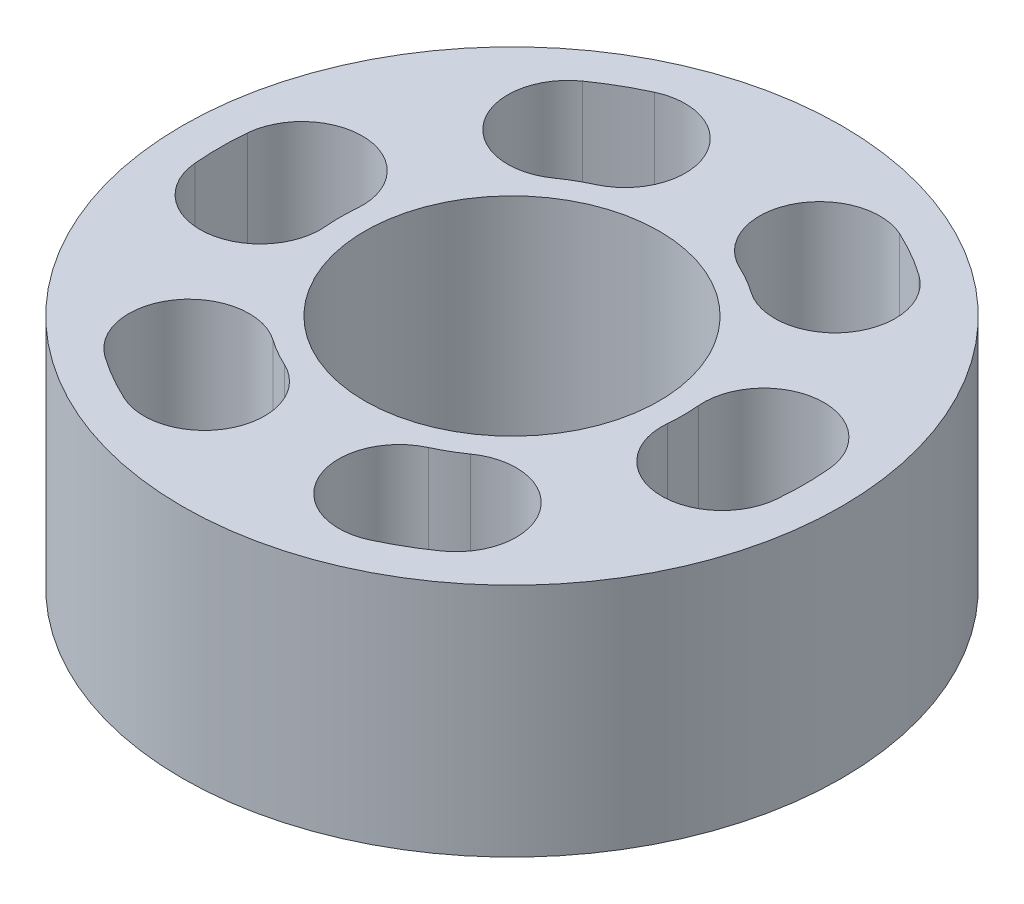
ISO-10303-21;
HEADER;
FILE_DESCRIPTION(('STEP AP214'),'2;1');
FILE_NAME('part.step','',(''),(''),'','','');
FILE_SCHEMA(('AUTOMOTIVE_DESIGN { 1 0 10303 214 1 1 1 1 }'));
ENDSEC;
DATA;
#1=APPLICATION_CONTEXT('core data for automotive mechanical design processes');
#2=APPLICATION_PROTOCOL_DEFINITION('international standard','automotive_design',2000,#1);
#3=PRODUCT_CONTEXT('',#1,'mechanical');
#4=PRODUCT('Part','Part','',(#3));
#5=PRODUCT_RELATED_PRODUCT_CATEGORY('part','',(#4));
#6=PRODUCT_DEFINITION_FORMATION('','',#4);
#7=PRODUCT_DEFINITION_CONTEXT('part definition',#1,'design');
#8=PRODUCT_DEFINITION('design','',#6,#7);
#9=PRODUCT_DEFINITION_SHAPE('','',#8);
#10=(LENGTH_UNIT() NAMED_UNIT(*) SI_UNIT(.MILLI.,.METRE.));
#11=(NAMED_UNIT(*) PLANE_ANGLE_UNIT() SI_UNIT($,.RADIAN.));
#12=(NAMED_UNIT(*) SI_UNIT($,.STERADIAN.) SOLID_ANGLE_UNIT());
#13=UNCERTAINTY_MEASURE_WITH_UNIT(LENGTH_MEASURE(1.E-05),#10,'distance_accuracy_value','');
#14=(GEOMETRIC_REPRESENTATION_CONTEXT(3) GLOBAL_UNCERTAINTY_ASSIGNED_CONTEXT((#13)) GLOBAL_UNIT_ASSIGNED_CONTEXT((#10,
#11,#12)) REPRESENTATION_CONTEXT('',''));
#15=CARTESIAN_POINT('',(0.,0.,0.));
#16=DIRECTION('',(0.,0.,1.));
#17=DIRECTION('',(1.,0.,0.));
#18=AXIS2_PLACEMENT_3D('',#15,#16,#17);
#19=CARTESIAN_POINT('',(0.,12.7,0.));
#20=DIRECTION('',(0.,1.,0.));
#21=DIRECTION('',(0.,0.,1.));
#22=AXIS2_PLACEMENT_3D('',#19,#20,#21);
#23=PLANE('',#22);
#24=CARTESIAN_POINT('',(-12.4492366115643,12.7,1.12539228240097));
#25=DIRECTION('',(0.,1.,0.));
#26=DIRECTION('',(0.866025403784436,0.,-0.500000000000004));
#27=AXIS2_PLACEMENT_3D('',#24,#25,#26);
#28=CIRCLE('',#27,3.25);
#29=CARTESIAN_POINT('',(-15.686038130571,12.7,1.41799427582523));
#30=VERTEX_POINT('',#29);
#31=CARTESIAN_POINT('',(-9.21243509255756,12.7,0.832790288976717));
#32=VERTEX_POINT('',#31);
#33=EDGE_CURVE('E63',#30,#32,#28,.T.);
#34=ORIENTED_EDGE('',*,*,#33,.F.);
#35=CARTESIAN_POINT('',(0.,12.7,0.));
#36=DIRECTION('',(0.,1.,0.));
#37=DIRECTION('',(-0.866025403784436,0.,0.500000000000004));
#38=AXIS2_PLACEMENT_3D('',#35,#36,#37);
#39=CIRCLE('',#38,15.75);
#40=CARTESIAN_POINT('',(-15.686038130571,12.7,-1.41799427582511));
#41=VERTEX_POINT('',#40);
#42=EDGE_CURVE('E245',#41,#30,#39,.T.);
#43=ORIENTED_EDGE('',*,*,#42,.F.);
#44=CARTESIAN_POINT('',(-12.4492366115643,12.7,-1.12539228240088));
#45=DIRECTION('',(0.,1.,0.));
#46=DIRECTION('',(-0.866025403784436,0.,0.500000000000004));
#47=AXIS2_PLACEMENT_3D('',#44,#45,#46);
#48=CIRCLE('',#47,3.25);
#49=CARTESIAN_POINT('',(-9.21243509255757,12.7,-0.832790288976654));
#50=VERTEX_POINT('',#49);
#51=EDGE_CURVE('E260',#50,#41,#48,.T.);
#52=ORIENTED_EDGE('',*,*,#51,.F.);
#53=CARTESIAN_POINT('',(0.,12.7,0.));
#54=DIRECTION('',(0.,-1.,0.));
#55=DIRECTION('',(-0.866025403784436,0.,0.500000000000004));
#56=AXIS2_PLACEMENT_3D('',#53,#54,#55);
#57=CIRCLE('',#56,9.25);
#58=EDGE_CURVE('E256',#32,#50,#57,.T.);
#59=ORIENTED_EDGE('',*,*,#58,.F.);
#60=EDGE_LOOP('',(#34,#43,#52,#59));
#61=FACE_BOUND('',#60,.T.);
#62=CARTESIAN_POINT('',(7.19923661156438,12.7,10.2186590221375));
#63=DIRECTION('',(0.,1.,0.));
#64=DIRECTION('',(-0.866025403784443,0.,-0.499999999999992));
#65=AXIS2_PLACEMENT_3D('',#62,#63,#64);
#66=CIRCLE('',#65,3.25);
#67=CARTESIAN_POINT('',(9.07103813057112,12.7,12.8755103678932));
#68=VERTEX_POINT('',#67);
#69=CARTESIAN_POINT('',(5.32743509255764,12.7,7.56180767638171));
#70=VERTEX_POINT('',#69);
#71=EDGE_CURVE('E317',#68,#70,#66,.T.);
#72=ORIENTED_EDGE('',*,*,#71,.F.);
#73=CARTESIAN_POINT('',(0.,12.7,0.));
#74=DIRECTION('',(0.,1.,0.));
#75=DIRECTION('',(0.866025403784443,0.,0.499999999999992));
#76=AXIS2_PLACEMENT_3D('',#73,#74,#75);
#77=CIRCLE('',#76,15.75);
#78=CARTESIAN_POINT('',(6.6150000000001,12.7,14.2935046437184));
#79=VERTEX_POINT('',#78);
#80=EDGE_CURVE('E307',#79,#68,#77,.T.);
#81=ORIENTED_EDGE('',*,*,#80,.F.);
#82=CARTESIAN_POINT('',(5.25000000000008,12.7,11.3440513045384));
#83=DIRECTION('',(0.,1.,0.));
#84=DIRECTION('',(0.866025403784443,0.,0.499999999999992));
#85=AXIS2_PLACEMENT_3D('',#82,#83,#84);
#86=CIRCLE('',#85,3.25);
#87=CARTESIAN_POINT('',(3.88500000000006,12.7,8.39459796535841));
#88=VERTEX_POINT('',#87);
#89=EDGE_CURVE('E323',#88,#79,#86,.T.);
#90=ORIENTED_EDGE('',*,*,#89,.F.);
#91=CARTESIAN_POINT('',(0.,12.7,0.));
#92=DIRECTION('',(0.,-1.,0.));
#93=DIRECTION('',(0.866025403784443,0.,0.499999999999992));
#94=AXIS2_PLACEMENT_3D('',#91,#92,#93);
#95=CIRCLE('',#94,9.25);
#96=EDGE_CURVE('E319',#70,#88,#95,.T.);
#97=ORIENTED_EDGE('',*,*,#96,.F.);
#98=EDGE_LOOP('',(#72,#81,#90,#97));
#99=FACE_BOUND('',#98,.T.);
#100=CARTESIAN_POINT('',(5.25,12.7,-11.3440513045384));
#101=DIRECTION('',(0.,1.,0.));
#102=DIRECTION('',(0.,0.,1.));
#103=AXIS2_PLACEMENT_3D('',#100,#101,#102);
#104=CIRCLE('',#103,3.25);
#105=CARTESIAN_POINT('',(6.615,12.7,-14.2935046437184));
#106=VERTEX_POINT('',#105);
#107=CARTESIAN_POINT('',(3.885,12.7,-8.39459796535844));
#108=VERTEX_POINT('',#107);
#109=EDGE_CURVE('E237',#106,#108,#104,.T.);
#110=ORIENTED_EDGE('',*,*,#109,.F.);
#111=CARTESIAN_POINT('',(0.,12.7,0.));
#112=DIRECTION('',(0.,1.,0.));
#113=DIRECTION('',(0.,0.,-1.));
#114=AXIS2_PLACEMENT_3D('',#111,#112,#113);
#115=CIRCLE('',#114,15.75);
#116=CARTESIAN_POINT('',(9.07103813057102,12.7,-12.8755103678933));
#117=VERTEX_POINT('',#116);
#118=EDGE_CURVE('E370',#117,#106,#115,.T.);
#119=ORIENTED_EDGE('',*,*,#118,.F.);
#120=CARTESIAN_POINT('',(7.19923661156431,12.7,-10.2186590221375));
#121=DIRECTION('',(0.,1.,0.));
#122=DIRECTION('',(0.,0.,-1.));
#123=AXIS2_PLACEMENT_3D('',#120,#121,#122);
#124=CIRCLE('',#123,3.25);
#125=CARTESIAN_POINT('',(5.32743509255759,12.7,-7.56180767638175));
#126=VERTEX_POINT('',#125);
#127=EDGE_CURVE('E384',#126,#117,#124,.T.);
#128=ORIENTED_EDGE('',*,*,#127,.F.);
#129=CARTESIAN_POINT('',(0.,12.7,0.));
#130=DIRECTION('',(0.,-1.,0.));
#131=DIRECTION('',(0.,0.,-1.));
#132=AXIS2_PLACEMENT_3D('',#129,#130,#131);
#133=CIRCLE('',#132,9.25);
#134=EDGE_CURVE('E381',#108,#126,#133,.T.);
#135=ORIENTED_EDGE('',*,*,#134,.F.);
#136=EDGE_LOOP('',(#110,#119,#128,#135));
#137=FACE_BOUND('',#136,.T.);
#138=CARTESIAN_POINT('',(0.,12.7,0.));
#139=DIRECTION('',(0.,1.,0.));
#140=DIRECTION('',(0.,0.,1.));
#141=AXIS2_PLACEMENT_3D('',#138,#139,#140);
#142=CIRCLE('',#141,17.78);
#143=CARTESIAN_POINT('',(0.,12.7,17.78));
#144=VERTEX_POINT('',#143);
#145=EDGE_CURVE('E11',#144,#144,#142,.T.);
#146=ORIENTED_EDGE('',*,*,#145,.T.);
#147=EDGE_LOOP('',(#146));
#148=FACE_BOUND('',#147,.T.);
#149=CARTESIAN_POINT('',(0.,12.7,0.));
#150=DIRECTION('',(0.,1.,0.));
#151=DIRECTION('',(0.,0.,1.));
#152=AXIS2_PLACEMENT_3D('',#149,#150,#151);
#153=CIRCLE('',#152,7.9375);
#154=CARTESIAN_POINT('',(0.,12.7,7.9375));
#155=VERTEX_POINT('',#154);
#156=EDGE_CURVE('E398',#155,#155,#153,.T.);
#157=ORIENTED_EDGE('',*,*,#156,.F.);
#158=EDGE_LOOP('',(#157));
#159=FACE_BOUND('',#158,.T.);
#160=CARTESIAN_POINT('',(12.4492366115643,12.7,-1.12539228240106));
#161=DIRECTION('',(0.,1.,0.));
#162=DIRECTION('',(-0.866025403784433,0.,0.50000000000001));
#163=AXIS2_PLACEMENT_3D('',#160,#161,#162);
#164=CIRCLE('',#163,3.25);
#165=CARTESIAN_POINT('',(15.686038130571,12.7,-1.41799427582533));
#166=VERTEX_POINT('',#165);
#167=CARTESIAN_POINT('',(9.21243509255756,12.7,-0.832790288976782));
#168=VERTEX_POINT('',#167);
#169=EDGE_CURVE('E349',#166,#168,#164,.T.);
#170=ORIENTED_EDGE('',*,*,#169,.F.);
#171=CARTESIAN_POINT('',(0.,12.7,0.));
#172=DIRECTION('',(0.,1.,0.));
#173=DIRECTION('',(0.866025403784433,0.,-0.50000000000001));
#174=AXIS2_PLACEMENT_3D('',#171,#172,#173);
#175=CIRCLE('',#174,15.75);
#176=CARTESIAN_POINT('',(15.686038130571,12.7,1.417994275825));
#177=VERTEX_POINT('',#176);
#178=EDGE_CURVE('E339',#177,#166,#175,.T.);
#179=ORIENTED_EDGE('',*,*,#178,.F.);
#180=CARTESIAN_POINT('',(12.4492366115643,12.7,1.1253922824008));
#181=DIRECTION('',(0.,1.,0.));
#182=DIRECTION('',(0.866025403784433,0.,-0.50000000000001));
#183=AXIS2_PLACEMENT_3D('',#180,#181,#182);
#184=CIRCLE('',#183,3.25);
#185=CARTESIAN_POINT('',(9.21243509255758,12.7,0.832790288976589));
#186=VERTEX_POINT('',#185);
#187=EDGE_CURVE('E354',#186,#177,#184,.T.);
#188=ORIENTED_EDGE('',*,*,#187,.F.);
#189=CARTESIAN_POINT('',(0.,12.7,0.));
#190=DIRECTION('',(0.,-1.,0.));
#191=DIRECTION('',(0.866025403784433,0.,-0.50000000000001));
#192=AXIS2_PLACEMENT_3D('',#189,#190,#191);
#193=CIRCLE('',#192,9.25);
#194=EDGE_CURVE('E351',#168,#186,#193,.T.);
#195=ORIENTED_EDGE('',*,*,#194,.F.);
#196=EDGE_LOOP('',(#170,#179,#188,#195));
#197=FACE_BOUND('',#196,.T.);
#198=CARTESIAN_POINT('',(-5.25,12.7,11.3440513045384));
#199=DIRECTION('',(0.,1.,0.));
#200=DIRECTION('',(0.,0.,-1.));
#201=AXIS2_PLACEMENT_3D('',#198,#199,#200);
#202=CIRCLE('',#201,3.25);
#203=CARTESIAN_POINT('',(-6.615,12.7,14.2935046437184));
#204=VERTEX_POINT('',#203);
#205=CARTESIAN_POINT('',(-3.885,12.7,8.39459796535844));
#206=VERTEX_POINT('',#205);
#207=EDGE_CURVE('E285',#204,#206,#202,.T.);
#208=ORIENTED_EDGE('',*,*,#207,.F.);
#209=CARTESIAN_POINT('',(0.,12.7,0.));
#210=DIRECTION('',(0.,1.,0.));
#211=DIRECTION('',(0.,0.,1.));
#212=AXIS2_PLACEMENT_3D('',#209,#210,#211);
#213=CIRCLE('',#212,15.75);
#214=CARTESIAN_POINT('',(-9.07103813057102,12.7,12.8755103678933));
#215=VERTEX_POINT('',#214);
#216=EDGE_CURVE('E275',#215,#204,#213,.T.);
#217=ORIENTED_EDGE('',*,*,#216,.F.);
#218=CARTESIAN_POINT('',(-7.19923661156431,12.7,10.2186590221375));
#219=DIRECTION('',(0.,1.,0.));
#220=DIRECTION('',(0.,0.,1.));
#221=AXIS2_PLACEMENT_3D('',#218,#219,#220);
#222=CIRCLE('',#221,3.25);
#223=CARTESIAN_POINT('',(-5.32743509255759,12.7,7.56180767638175));
#224=VERTEX_POINT('',#223);
#225=EDGE_CURVE('E291',#224,#215,#222,.T.);
#226=ORIENTED_EDGE('',*,*,#225,.F.);
#227=CARTESIAN_POINT('',(0.,12.7,0.));
#228=DIRECTION('',(0.,-1.,0.));
#229=DIRECTION('',(0.,0.,1.));
#230=AXIS2_PLACEMENT_3D('',#227,#228,#229);
#231=CIRCLE('',#230,9.25);
#232=EDGE_CURVE('E287',#206,#224,#231,.T.);
#233=ORIENTED_EDGE('',*,*,#232,.F.);
#234=EDGE_LOOP('',(#208,#217,#226,#233));
#235=FACE_BOUND('',#234,.T.);
#236=CARTESIAN_POINT('',(-7.19923661156431,12.7,-10.2186590221375));
#237=DIRECTION('',(0.,1.,0.));
#238=DIRECTION('',(0.86602540378444,0.,0.499999999999998));
#239=AXIS2_PLACEMENT_3D('',#236,#237,#238);
#240=CIRCLE('',#239,3.25);
#241=CARTESIAN_POINT('',(-9.07103813057102,12.7,-12.8755103678932));
#242=VERTEX_POINT('',#241);
#243=CARTESIAN_POINT('',(-5.32743509255759,12.7,-7.56180767638175));
#244=VERTEX_POINT('',#243);
#245=EDGE_CURVE('E55',#242,#244,#240,.T.);
#246=ORIENTED_EDGE('',*,*,#245,.F.);
#247=CARTESIAN_POINT('',(0.,12.7,0.));
#248=DIRECTION('',(0.,1.,0.));
#249=DIRECTION('',(-0.86602540378444,0.,-0.499999999999998));
#250=AXIS2_PLACEMENT_3D('',#247,#248,#249);
#251=CIRCLE('',#250,15.75);
#252=CARTESIAN_POINT('',(-6.615,12.7,-14.2935046437184));
#253=VERTEX_POINT('',#252);
#254=EDGE_CURVE('E221',#253,#242,#251,.T.);
#255=ORIENTED_EDGE('',*,*,#254,.F.);
#256=CARTESIAN_POINT('',(-5.25,12.7,-11.3440513045384));
#257=DIRECTION('',(0.,1.,0.));
#258=DIRECTION('',(-0.86602540378444,0.,-0.499999999999998));
#259=AXIS2_PLACEMENT_3D('',#256,#257,#258);
#260=CIRCLE('',#259,3.25);
#261=CARTESIAN_POINT('',(-3.885,12.7,-8.39459796535844));
#262=VERTEX_POINT('',#261);
#263=EDGE_CURVE('E224',#262,#253,#260,.T.);
#264=ORIENTED_EDGE('',*,*,#263,.F.);
#265=CARTESIAN_POINT('',(0.,12.7,0.));
#266=DIRECTION('',(0.,-1.,0.));
#267=DIRECTION('',(-0.86602540378444,0.,-0.499999999999998));
#268=AXIS2_PLACEMENT_3D('',#265,#266,#267);
#269=CIRCLE('',#268,9.25);
#270=EDGE_CURVE('E230',#244,#262,#269,.T.);
#271=ORIENTED_EDGE('',*,*,#270,.F.);
#272=EDGE_LOOP('',(#246,#255,#264,#271));
#273=FACE_BOUND('',#272,.T.);
#274=ADVANCED_FACE('F40',(#61,#99,#137,#148,#159,#197,#235,#273),#23,.T.);
#275=CARTESIAN_POINT('',(0.,0.,0.));
#276=DIRECTION('',(0.,1.,0.));
#277=DIRECTION('',(0.,0.,1.));
#278=AXIS2_PLACEMENT_3D('',#275,#276,#277);
#279=PLANE('',#278);
#280=CARTESIAN_POINT('',(0.,0.,0.));
#281=DIRECTION('',(0.,1.,0.));
#282=DIRECTION('',(0.,0.,1.));
#283=AXIS2_PLACEMENT_3D('',#280,#281,#282);
#284=CIRCLE('',#283,17.78);
#285=CARTESIAN_POINT('',(0.,0.,17.78));
#286=VERTEX_POINT('',#285);
#287=EDGE_CURVE('E44',#286,#286,#284,.T.);
#288=ORIENTED_EDGE('',*,*,#287,.F.);
#289=EDGE_LOOP('',(#288));
#290=FACE_BOUND('',#289,.T.);
#291=CARTESIAN_POINT('',(0.,0.,0.));
#292=DIRECTION('',(0.,1.,0.));
#293=DIRECTION('',(0.,0.,1.));
#294=AXIS2_PLACEMENT_3D('',#291,#292,#293);
#295=CIRCLE('',#294,7.9375);
#296=CARTESIAN_POINT('',(0.,0.,7.9375));
#297=VERTEX_POINT('',#296);
#298=EDGE_CURVE('E391',#297,#297,#295,.T.);
#299=ORIENTED_EDGE('',*,*,#298,.T.);
#300=EDGE_LOOP('',(#299));
#301=FACE_BOUND('',#300,.T.);
#302=CARTESIAN_POINT('',(0.,0.,0.));
#303=DIRECTION('',(0.,1.,0.));
#304=DIRECTION('',(0.,0.,-1.));
#305=AXIS2_PLACEMENT_3D('',#302,#303,#304);
#306=CIRCLE('',#305,15.75);
#307=CARTESIAN_POINT('',(9.07103813057102,0.,-12.8755103678933));
#308=VERTEX_POINT('',#307);
#309=CARTESIAN_POINT('',(6.615,0.,-14.2935046437184));
#310=VERTEX_POINT('',#309);
#311=EDGE_CURVE('E376',#308,#310,#306,.T.);
#312=ORIENTED_EDGE('',*,*,#311,.T.);
#313=CARTESIAN_POINT('',(5.25,0.,-11.3440513045384));
#314=DIRECTION('',(0.,1.,0.));
#315=DIRECTION('',(0.,0.,1.));
#316=AXIS2_PLACEMENT_3D('',#313,#314,#315);
#317=CIRCLE('',#316,3.25);
#318=CARTESIAN_POINT('',(3.885,0.,-8.39459796535844));
#319=VERTEX_POINT('',#318);
#320=EDGE_CURVE('E366',#310,#319,#317,.T.);
#321=ORIENTED_EDGE('',*,*,#320,.T.);
#322=CARTESIAN_POINT('',(0.,0.,0.));
#323=DIRECTION('',(0.,-1.,0.));
#324=DIRECTION('',(0.,0.,-1.));
#325=AXIS2_PLACEMENT_3D('',#322,#323,#324);
#326=CIRCLE('',#325,9.25);
#327=CARTESIAN_POINT('',(5.32743509255759,0.,-7.56180767638175));
#328=VERTEX_POINT('',#327);
#329=EDGE_CURVE('E369',#319,#328,#326,.T.);
#330=ORIENTED_EDGE('',*,*,#329,.T.);
#331=CARTESIAN_POINT('',(7.19923661156431,0.,-10.2186590221375));
#332=DIRECTION('',(0.,1.,0.));
#333=DIRECTION('',(0.,0.,-1.));
#334=AXIS2_PLACEMENT_3D('',#331,#332,#333);
#335=CIRCLE('',#334,3.25);
#336=EDGE_CURVE('E373',#328,#308,#335,.T.);
#337=ORIENTED_EDGE('',*,*,#336,.T.);
#338=EDGE_LOOP('',(#312,#321,#330,#337));
#339=FACE_BOUND('',#338,.T.);
#340=CARTESIAN_POINT('',(0.,0.,0.));
#341=DIRECTION('',(0.,1.,0.));
#342=DIRECTION('',(0.866025403784433,0.,-0.50000000000001));
#343=AXIS2_PLACEMENT_3D('',#340,#341,#342);
#344=CIRCLE('',#343,15.75);
#345=CARTESIAN_POINT('',(15.686038130571,0.,1.417994275825));
#346=VERTEX_POINT('',#345);
#347=CARTESIAN_POINT('',(15.686038130571,0.,-1.41799427582533));
#348=VERTEX_POINT('',#347);
#349=EDGE_CURVE('E345',#346,#348,#344,.T.);
#350=ORIENTED_EDGE('',*,*,#349,.T.);
#351=CARTESIAN_POINT('',(12.4492366115643,0.,-1.12539228240106));
#352=DIRECTION('',(0.,1.,0.));
#353=DIRECTION('',(-0.866025403784433,0.,0.50000000000001));
#354=AXIS2_PLACEMENT_3D('',#351,#352,#353);
#355=CIRCLE('',#354,3.25);
#356=CARTESIAN_POINT('',(9.21243509255756,0.,-0.832790288976782));
#357=VERTEX_POINT('',#356);
#358=EDGE_CURVE('E335',#348,#357,#355,.T.);
#359=ORIENTED_EDGE('',*,*,#358,.T.);
#360=CARTESIAN_POINT('',(0.,0.,0.));
#361=DIRECTION('',(0.,-1.,0.));
#362=DIRECTION('',(0.866025403784433,0.,-0.50000000000001));
#363=AXIS2_PLACEMENT_3D('',#360,#361,#362);
#364=CIRCLE('',#363,9.25);
#365=CARTESIAN_POINT('',(9.21243509255758,0.,0.832790288976588));
#366=VERTEX_POINT('',#365);
#367=EDGE_CURVE('E338',#357,#366,#364,.T.);
#368=ORIENTED_EDGE('',*,*,#367,.T.);
#369=CARTESIAN_POINT('',(12.4492366115643,0.,1.1253922824008));
#370=DIRECTION('',(0.,1.,0.));
#371=DIRECTION('',(0.866025403784433,0.,-0.50000000000001));
#372=AXIS2_PLACEMENT_3D('',#369,#370,#371);
#373=CIRCLE('',#372,3.25);
#374=EDGE_CURVE('E342',#366,#346,#373,.T.);
#375=ORIENTED_EDGE('',*,*,#374,.T.);
#376=EDGE_LOOP('',(#350,#359,#368,#375));
#377=FACE_BOUND('',#376,.T.);
#378=CARTESIAN_POINT('',(0.,0.,0.));
#379=DIRECTION('',(0.,1.,0.));
#380=DIRECTION('',(0.866025403784443,0.,0.499999999999992));
#381=AXIS2_PLACEMENT_3D('',#378,#379,#380);
#382=CIRCLE('',#381,15.75);
#383=CARTESIAN_POINT('',(6.6150000000001,0.,14.2935046437184));
#384=VERTEX_POINT('',#383);
#385=CARTESIAN_POINT('',(9.07103813057112,0.,12.8755103678932));
#386=VERTEX_POINT('',#385);
#387=EDGE_CURVE('E313',#384,#386,#382,.T.);
#388=ORIENTED_EDGE('',*,*,#387,.T.);
#389=CARTESIAN_POINT('',(7.19923661156438,0.,10.2186590221375));
#390=DIRECTION('',(0.,1.,0.));
#391=DIRECTION('',(-0.866025403784443,0.,-0.499999999999992));
#392=AXIS2_PLACEMENT_3D('',#389,#390,#391);
#393=CIRCLE('',#392,3.25);
#394=CARTESIAN_POINT('',(5.32743509255764,0.,7.56180767638171));
#395=VERTEX_POINT('',#394);
#396=EDGE_CURVE('E303',#386,#395,#393,.T.);
#397=ORIENTED_EDGE('',*,*,#396,.T.);
#398=CARTESIAN_POINT('',(0.,0.,0.));
#399=DIRECTION('',(0.,-1.,0.));
#400=DIRECTION('',(0.866025403784443,0.,0.499999999999992));
#401=AXIS2_PLACEMENT_3D('',#398,#399,#400);
#402=CIRCLE('',#401,9.25);
#403=CARTESIAN_POINT('',(3.88500000000006,0.,8.39459796535841));
#404=VERTEX_POINT('',#403);
#405=EDGE_CURVE('E306',#395,#404,#402,.T.);
#406=ORIENTED_EDGE('',*,*,#405,.T.);
#407=CARTESIAN_POINT('',(5.25000000000008,0.,11.3440513045384));
#408=DIRECTION('',(0.,1.,0.));
#409=DIRECTION('',(0.866025403784443,0.,0.499999999999992));
#410=AXIS2_PLACEMENT_3D('',#407,#408,#409);
#411=CIRCLE('',#410,3.25);
#412=EDGE_CURVE('E310',#404,#384,#411,.T.);
#413=ORIENTED_EDGE('',*,*,#412,.T.);
#414=EDGE_LOOP('',(#388,#397,#406,#413));
#415=FACE_BOUND('',#414,.T.);
#416=CARTESIAN_POINT('',(0.,0.,0.));
#417=DIRECTION('',(0.,1.,0.));
#418=DIRECTION('',(0.,0.,1.));
#419=AXIS2_PLACEMENT_3D('',#416,#417,#418);
#420=CIRCLE('',#419,15.75);
#421=CARTESIAN_POINT('',(-9.07103813057102,0.,12.8755103678933));
#422=VERTEX_POINT('',#421);
#423=CARTESIAN_POINT('',(-6.615,0.,14.2935046437184));
#424=VERTEX_POINT('',#423);
#425=EDGE_CURVE('E281',#422,#424,#420,.T.);
#426=ORIENTED_EDGE('',*,*,#425,.T.);
#427=CARTESIAN_POINT('',(-5.25,0.,11.3440513045384));
#428=DIRECTION('',(0.,1.,0.));
#429=DIRECTION('',(0.,0.,-1.));
#430=AXIS2_PLACEMENT_3D('',#427,#428,#429);
#431=CIRCLE('',#430,3.25);
#432=CARTESIAN_POINT('',(-3.885,0.,8.39459796535844));
#433=VERTEX_POINT('',#432);
#434=EDGE_CURVE('E271',#424,#433,#431,.T.);
#435=ORIENTED_EDGE('',*,*,#434,.T.);
#436=CARTESIAN_POINT('',(0.,0.,0.));
#437=DIRECTION('',(0.,-1.,0.));
#438=DIRECTION('',(0.,0.,1.));
#439=AXIS2_PLACEMENT_3D('',#436,#437,#438);
#440=CIRCLE('',#439,9.25);
#441=CARTESIAN_POINT('',(-5.32743509255759,0.,7.56180767638175));
#442=VERTEX_POINT('',#441);
#443=EDGE_CURVE('E274',#433,#442,#440,.T.);
#444=ORIENTED_EDGE('',*,*,#443,.T.);
#445=CARTESIAN_POINT('',(-7.19923661156431,0.,10.2186590221375));
#446=DIRECTION('',(0.,1.,0.));
#447=DIRECTION('',(0.,0.,1.));
#448=AXIS2_PLACEMENT_3D('',#445,#446,#447);
#449=CIRCLE('',#448,3.25);
#450=EDGE_CURVE('E278',#442,#422,#449,.T.);
#451=ORIENTED_EDGE('',*,*,#450,.T.);
#452=EDGE_LOOP('',(#426,#435,#444,#451));
#453=FACE_BOUND('',#452,.T.);
#454=CARTESIAN_POINT('',(0.,0.,0.));
#455=DIRECTION('',(0.,1.,0.));
#456=DIRECTION('',(-0.866025403784436,0.,0.500000000000004));
#457=AXIS2_PLACEMENT_3D('',#454,#455,#456);
#458=CIRCLE('',#457,15.75);
#459=CARTESIAN_POINT('',(-15.686038130571,0.,-1.41799427582511));
#460=VERTEX_POINT('',#459);
#461=CARTESIAN_POINT('',(-15.686038130571,0.,1.41799427582523));
#462=VERTEX_POINT('',#461);
#463=EDGE_CURVE('E251',#460,#462,#458,.T.);
#464=ORIENTED_EDGE('',*,*,#463,.T.);
#465=CARTESIAN_POINT('',(-12.4492366115643,0.,1.12539228240097));
#466=DIRECTION('',(0.,1.,0.));
#467=DIRECTION('',(0.866025403784436,0.,-0.500000000000004));
#468=AXIS2_PLACEMENT_3D('',#465,#466,#467);
#469=CIRCLE('',#468,3.25);
#470=CARTESIAN_POINT('',(-9.21243509255757,0.,0.832790288976717));
#471=VERTEX_POINT('',#470);
#472=EDGE_CURVE('E241',#462,#471,#469,.T.);
#473=ORIENTED_EDGE('',*,*,#472,.T.);
#474=CARTESIAN_POINT('',(0.,0.,0.));
#475=DIRECTION('',(0.,-1.,0.));
#476=DIRECTION('',(-0.866025403784436,0.,0.500000000000004));
#477=AXIS2_PLACEMENT_3D('',#474,#475,#476);
#478=CIRCLE('',#477,9.25);
#479=CARTESIAN_POINT('',(-9.21243509255757,0.,-0.832790288976653));
#480=VERTEX_POINT('',#479);
#481=EDGE_CURVE('E244',#471,#480,#478,.T.);
#482=ORIENTED_EDGE('',*,*,#481,.T.);
#483=CARTESIAN_POINT('',(-12.4492366115643,0.,-1.12539228240088));
#484=DIRECTION('',(0.,1.,0.));
#485=DIRECTION('',(-0.866025403784436,0.,0.500000000000004));
#486=AXIS2_PLACEMENT_3D('',#483,#484,#485);
#487=CIRCLE('',#486,3.25);
#488=EDGE_CURVE('E248',#480,#460,#487,.T.);
#489=ORIENTED_EDGE('',*,*,#488,.T.);
#490=EDGE_LOOP('',(#464,#473,#482,#489));
#491=FACE_BOUND('',#490,.T.);
#492=CARTESIAN_POINT('',(0.,0.,0.));
#493=DIRECTION('',(0.,1.,0.));
#494=DIRECTION('',(-0.86602540378444,0.,-0.499999999999998));
#495=AXIS2_PLACEMENT_3D('',#492,#493,#494);
#496=CIRCLE('',#495,15.75);
#497=CARTESIAN_POINT('',(-6.615,0.,-14.2935046437184));
#498=VERTEX_POINT('',#497);
#499=CARTESIAN_POINT('',(-9.07103813057102,0.,-12.8755103678932));
#500=VERTEX_POINT('',#499);
#501=EDGE_CURVE('E209',#498,#500,#496,.T.);
#502=ORIENTED_EDGE('',*,*,#501,.T.);
#503=CARTESIAN_POINT('',(-7.19923661156431,0.,-10.2186590221375));
#504=DIRECTION('',(0.,1.,0.));
#505=DIRECTION('',(0.86602540378444,0.,0.499999999999998));
#506=AXIS2_PLACEMENT_3D('',#503,#504,#505);
#507=CIRCLE('',#506,3.25);
#508=CARTESIAN_POINT('',(-5.32743509255759,0.,-7.56180767638175));
#509=VERTEX_POINT('',#508);
#510=EDGE_CURVE('E203',#500,#509,#507,.T.);
#511=ORIENTED_EDGE('',*,*,#510,.T.);
#512=CARTESIAN_POINT('',(0.,0.,0.));
#513=DIRECTION('',(0.,-1.,0.));
#514=DIRECTION('',(-0.86602540378444,0.,-0.499999999999998));
#515=AXIS2_PLACEMENT_3D('',#512,#513,#514);
#516=CIRCLE('',#515,9.25);
#517=CARTESIAN_POINT('',(-3.885,0.,-8.39459796535844));
#518=VERTEX_POINT('',#517);
#519=EDGE_CURVE('E213',#509,#518,#516,.T.);
#520=ORIENTED_EDGE('',*,*,#519,.T.);
#521=CARTESIAN_POINT('',(-5.25,0.,-11.3440513045384));
#522=DIRECTION('',(0.,1.,0.));
#523=DIRECTION('',(-0.86602540378444,0.,-0.499999999999998));
#524=AXIS2_PLACEMENT_3D('',#521,#522,#523);
#525=CIRCLE('',#524,3.25);
#526=EDGE_CURVE('E217',#518,#498,#525,.T.);
#527=ORIENTED_EDGE('',*,*,#526,.T.);
#528=EDGE_LOOP('',(#502,#511,#520,#527));
#529=FACE_BOUND('',#528,.T.);
#530=ADVANCED_FACE('F219',(#290,#301,#339,#377,#415,#453,#491,#529),#279,.F.);
#531=CARTESIAN_POINT('',(0.,12.7,0.));
#532=DIRECTION('',(0.,-1.,0.));
#533=DIRECTION('',(0.,0.,-1.));
#534=AXIS2_PLACEMENT_3D('',#531,#532,#533);
#535=CYLINDRICAL_SURFACE('',#534,17.78);
#536=ORIENTED_EDGE('',*,*,#145,.F.);
#537=EDGE_LOOP('',(#536));
#538=FACE_BOUND('',#537,.T.);
#539=ORIENTED_EDGE('',*,*,#287,.T.);
#540=EDGE_LOOP('',(#539));
#541=FACE_BOUND('',#540,.T.);
#542=ADVANCED_FACE('F42',(#538,#541),#535,.T.);
#543=CARTESIAN_POINT('',(0.,12.7,0.));
#544=DIRECTION('',(0.,-1.,0.));
#545=DIRECTION('',(0.,0.,-1.));
#546=AXIS2_PLACEMENT_3D('',#543,#544,#545);
#547=CYLINDRICAL_SURFACE('',#546,7.9375);
#548=ORIENTED_EDGE('',*,*,#156,.T.);
#549=EDGE_LOOP('',(#548));
#550=FACE_BOUND('',#549,.T.);
#551=ORIENTED_EDGE('',*,*,#298,.F.);
#552=EDGE_LOOP('',(#551));
#553=FACE_BOUND('',#552,.T.);
#554=ADVANCED_FACE('F406',(#550,#553),#547,.F.);
#555=CARTESIAN_POINT('',(5.25,0.,-11.3440513045384));
#556=DIRECTION('',(0.,1.,0.));
#557=DIRECTION('',(0.,0.,1.));
#558=AXIS2_PLACEMENT_3D('',#555,#556,#557);
#559=CYLINDRICAL_SURFACE('',#558,3.25);
#560=ORIENTED_EDGE('',*,*,#109,.T.);
#561=DIRECTION('',(0.,1.,0.));
#562=VECTOR('',#561,1.);
#563=CARTESIAN_POINT('',(3.885,0.,-8.39459796535844));
#564=LINE('',#563,#562);
#565=EDGE_CURVE('E379',#319,#108,#564,.T.);
#566=ORIENTED_EDGE('',*,*,#565,.F.);
#567=ORIENTED_EDGE('',*,*,#320,.F.);
#568=DIRECTION('',(0.,1.,0.));
#569=VECTOR('',#568,1.);
#570=CARTESIAN_POINT('',(6.615,0.,-14.2935046437184));
#571=LINE('',#570,#569);
#572=EDGE_CURVE('E389',#310,#106,#571,.T.);
#573=ORIENTED_EDGE('',*,*,#572,.T.);
#574=EDGE_LOOP('',(#560,#566,#567,#573));
#575=FACE_BOUND('',#574,.T.);
#576=ADVANCED_FACE('F408',(#575),#559,.F.);
#577=CARTESIAN_POINT('',(0.,0.,0.));
#578=DIRECTION('',(0.,1.,0.));
#579=DIRECTION('',(0.,0.,1.));
#580=AXIS2_PLACEMENT_3D('',#577,#578,#579);
#581=CYLINDRICAL_SURFACE('',#580,15.75);
#582=ORIENTED_EDGE('',*,*,#118,.T.);
#583=ORIENTED_EDGE('',*,*,#572,.F.);
#584=ORIENTED_EDGE('',*,*,#311,.F.);
#585=DIRECTION('',(0.,1.,0.));
#586=VECTOR('',#585,1.);
#587=CARTESIAN_POINT('',(9.07103813057102,0.,-12.8755103678933));
#588=LINE('',#587,#586);
#589=EDGE_CURVE('E392',#308,#117,#588,.T.);
#590=ORIENTED_EDGE('',*,*,#589,.T.);
#591=EDGE_LOOP('',(#582,#583,#584,#590));
#592=FACE_BOUND('',#591,.T.);
#593=ADVANCED_FACE('F415',(#592),#581,.F.);
#594=CARTESIAN_POINT('',(7.19923661156431,0.,-10.2186590221375));
#595=DIRECTION('',(0.,1.,0.));
#596=DIRECTION('',(0.,0.,1.));
#597=AXIS2_PLACEMENT_3D('',#594,#595,#596);
#598=CYLINDRICAL_SURFACE('',#597,3.25);
#599=ORIENTED_EDGE('',*,*,#127,.T.);
#600=ORIENTED_EDGE('',*,*,#589,.F.);
#601=ORIENTED_EDGE('',*,*,#336,.F.);
#602=DIRECTION('',(0.,1.,0.));
#603=VECTOR('',#602,1.);
#604=CARTESIAN_POINT('',(5.32743509255759,0.,-7.56180767638175));
#605=LINE('',#604,#603);
#606=EDGE_CURVE('E394',#328,#126,#605,.T.);
#607=ORIENTED_EDGE('',*,*,#606,.T.);
#608=EDGE_LOOP('',(#599,#600,#601,#607));
#609=FACE_BOUND('',#608,.T.);
#610=ADVANCED_FACE('F532',(#609),#598,.F.);
#611=CARTESIAN_POINT('',(0.,0.,0.));
#612=DIRECTION('',(0.,1.,0.));
#613=DIRECTION('',(0.,0.,1.));
#614=AXIS2_PLACEMENT_3D('',#611,#612,#613);
#615=CYLINDRICAL_SURFACE('',#614,9.25);
#616=ORIENTED_EDGE('',*,*,#134,.T.);
#617=ORIENTED_EDGE('',*,*,#606,.F.);
#618=ORIENTED_EDGE('',*,*,#329,.F.);
#619=ORIENTED_EDGE('',*,*,#565,.T.);
#620=EDGE_LOOP('',(#616,#617,#618,#619));
#621=FACE_BOUND('',#620,.T.);
#622=ADVANCED_FACE('F528',(#621),#615,.T.);
#623=CARTESIAN_POINT('',(12.4492366115643,0.,-1.12539228240106));
#624=DIRECTION('',(0.,1.,0.));
#625=DIRECTION('',(0.,0.,1.));
#626=AXIS2_PLACEMENT_3D('',#623,#624,#625);
#627=CYLINDRICAL_SURFACE('',#626,3.25);
#628=ORIENTED_EDGE('',*,*,#169,.T.);
#629=DIRECTION('',(0.,1.,0.));
#630=VECTOR('',#629,1.);
#631=CARTESIAN_POINT('',(9.21243509255756,0.,-0.832790288976782));
#632=LINE('',#631,#630);
#633=EDGE_CURVE('E348',#357,#168,#632,.T.);
#634=ORIENTED_EDGE('',*,*,#633,.F.);
#635=ORIENTED_EDGE('',*,*,#358,.F.);
#636=DIRECTION('',(0.,1.,0.));
#637=VECTOR('',#636,1.);
#638=CARTESIAN_POINT('',(15.686038130571,0.,-1.41799427582533));
#639=LINE('',#638,#637);
#640=EDGE_CURVE('E320',#348,#166,#639,.T.);
#641=ORIENTED_EDGE('',*,*,#640,.T.);
#642=EDGE_LOOP('',(#628,#634,#635,#641));
#643=FACE_BOUND('',#642,.T.);
#644=ADVANCED_FACE('F518',(#643),#627,.F.);
#645=CARTESIAN_POINT('',(0.,0.,0.));
#646=DIRECTION('',(0.,1.,0.));
#647=DIRECTION('',(0.,0.,1.));
#648=AXIS2_PLACEMENT_3D('',#645,#646,#647);
#649=CYLINDRICAL_SURFACE('',#648,15.75);
#650=ORIENTED_EDGE('',*,*,#178,.T.);
#651=ORIENTED_EDGE('',*,*,#640,.F.);
#652=ORIENTED_EDGE('',*,*,#349,.F.);
#653=DIRECTION('',(0.,1.,0.));
#654=VECTOR('',#653,1.);
#655=CARTESIAN_POINT('',(15.686038130571,0.,1.417994275825));
#656=LINE('',#655,#654);
#657=EDGE_CURVE('E360',#346,#177,#656,.T.);
#658=ORIENTED_EDGE('',*,*,#657,.T.);
#659=EDGE_LOOP('',(#650,#651,#652,#658));
#660=FACE_BOUND('',#659,.T.);
#661=ADVANCED_FACE('F514',(#660),#649,.F.);
#662=CARTESIAN_POINT('',(12.4492366115643,0.,1.1253922824008));
#663=DIRECTION('',(0.,1.,0.));
#664=DIRECTION('',(0.,0.,1.));
#665=AXIS2_PLACEMENT_3D('',#662,#663,#664);
#666=CYLINDRICAL_SURFACE('',#665,3.25);
#667=ORIENTED_EDGE('',*,*,#187,.T.);
#668=ORIENTED_EDGE('',*,*,#657,.F.);
#669=ORIENTED_EDGE('',*,*,#374,.F.);
#670=DIRECTION('',(0.,1.,0.));
#671=VECTOR('',#670,1.);
#672=CARTESIAN_POINT('',(9.21243509255758,0.,0.832790288976589));
#673=LINE('',#672,#671);
#674=EDGE_CURVE('E362',#366,#186,#673,.T.);
#675=ORIENTED_EDGE('',*,*,#674,.T.);
#676=EDGE_LOOP('',(#667,#668,#669,#675));
#677=FACE_BOUND('',#676,.T.);
#678=ADVANCED_FACE('F517',(#677),#666,.F.);
#679=CARTESIAN_POINT('',(0.,0.,0.));
#680=DIRECTION('',(0.,1.,0.));
#681=DIRECTION('',(0.,0.,1.));
#682=AXIS2_PLACEMENT_3D('',#679,#680,#681);
#683=CYLINDRICAL_SURFACE('',#682,9.25);
#684=ORIENTED_EDGE('',*,*,#194,.T.);
#685=ORIENTED_EDGE('',*,*,#674,.F.);
#686=ORIENTED_EDGE('',*,*,#367,.F.);
#687=ORIENTED_EDGE('',*,*,#633,.T.);
#688=EDGE_LOOP('',(#684,#685,#686,#687));
#689=FACE_BOUND('',#688,.T.);
#690=ADVANCED_FACE('F512',(#689),#683,.T.);
#691=CARTESIAN_POINT('',(7.19923661156438,0.,10.2186590221375));
#692=DIRECTION('',(0.,1.,0.));
#693=DIRECTION('',(0.,0.,1.));
#694=AXIS2_PLACEMENT_3D('',#691,#692,#693);
#695=CYLINDRICAL_SURFACE('',#694,3.25);
#696=ORIENTED_EDGE('',*,*,#71,.T.);
#697=DIRECTION('',(0.,1.,0.));
#698=VECTOR('',#697,1.);
#699=CARTESIAN_POINT('',(5.32743509255764,0.,7.56180767638171));
#700=LINE('',#699,#698);
#701=EDGE_CURVE('E316',#395,#70,#700,.T.);
#702=ORIENTED_EDGE('',*,*,#701,.F.);
#703=ORIENTED_EDGE('',*,*,#396,.F.);
#704=DIRECTION('',(0.,1.,0.));
#705=VECTOR('',#704,1.);
#706=CARTESIAN_POINT('',(9.07103813057112,0.,12.8755103678932));
#707=LINE('',#706,#705);
#708=EDGE_CURVE('E288',#386,#68,#707,.T.);
#709=ORIENTED_EDGE('',*,*,#708,.T.);
#710=EDGE_LOOP('',(#696,#702,#703,#709));
#711=FACE_BOUND('',#710,.T.);
#712=ADVANCED_FACE('F502',(#711),#695,.F.);
#713=CARTESIAN_POINT('',(0.,0.,0.));
#714=DIRECTION('',(0.,1.,0.));
#715=DIRECTION('',(0.,0.,1.));
#716=AXIS2_PLACEMENT_3D('',#713,#714,#715);
#717=CYLINDRICAL_SURFACE('',#716,15.75);
#718=ORIENTED_EDGE('',*,*,#80,.T.);
#719=ORIENTED_EDGE('',*,*,#708,.F.);
#720=ORIENTED_EDGE('',*,*,#387,.F.);
#721=DIRECTION('',(0.,1.,0.));
#722=VECTOR('',#721,1.);
#723=CARTESIAN_POINT('',(6.6150000000001,0.,14.2935046437184));
#724=LINE('',#723,#722);
#725=EDGE_CURVE('E329',#384,#79,#724,.T.);
#726=ORIENTED_EDGE('',*,*,#725,.T.);
#727=EDGE_LOOP('',(#718,#719,#720,#726));
#728=FACE_BOUND('',#727,.T.);
#729=ADVANCED_FACE('F498',(#728),#717,.F.);
#730=CARTESIAN_POINT('',(5.25000000000008,0.,11.3440513045384));
#731=DIRECTION('',(0.,1.,0.));
#732=DIRECTION('',(0.,0.,1.));
#733=AXIS2_PLACEMENT_3D('',#730,#731,#732);
#734=CYLINDRICAL_SURFACE('',#733,3.25);
#735=ORIENTED_EDGE('',*,*,#89,.T.);
#736=ORIENTED_EDGE('',*,*,#725,.F.);
#737=ORIENTED_EDGE('',*,*,#412,.F.);
#738=DIRECTION('',(0.,1.,0.));
#739=VECTOR('',#738,1.);
#740=CARTESIAN_POINT('',(3.88500000000006,0.,8.39459796535841));
#741=LINE('',#740,#739);
#742=EDGE_CURVE('E331',#404,#88,#741,.T.);
#743=ORIENTED_EDGE('',*,*,#742,.T.);
#744=EDGE_LOOP('',(#735,#736,#737,#743));
#745=FACE_BOUND('',#744,.T.);
#746=ADVANCED_FACE('F501',(#745),#734,.F.);
#747=CARTESIAN_POINT('',(0.,0.,0.));
#748=DIRECTION('',(0.,1.,0.));
#749=DIRECTION('',(0.,0.,1.));
#750=AXIS2_PLACEMENT_3D('',#747,#748,#749);
#751=CYLINDRICAL_SURFACE('',#750,9.25);
#752=ORIENTED_EDGE('',*,*,#96,.T.);
#753=ORIENTED_EDGE('',*,*,#742,.F.);
#754=ORIENTED_EDGE('',*,*,#405,.F.);
#755=ORIENTED_EDGE('',*,*,#701,.T.);
#756=EDGE_LOOP('',(#752,#753,#754,#755));
#757=FACE_BOUND('',#756,.T.);
#758=ADVANCED_FACE('F496',(#757),#751,.T.);
#759=CARTESIAN_POINT('',(-5.25,0.,11.3440513045384));
#760=DIRECTION('',(0.,1.,0.));
#761=DIRECTION('',(0.,0.,1.));
#762=AXIS2_PLACEMENT_3D('',#759,#760,#761);
#763=CYLINDRICAL_SURFACE('',#762,3.25);
#764=ORIENTED_EDGE('',*,*,#207,.T.);
#765=DIRECTION('',(0.,1.,0.));
#766=VECTOR('',#765,1.);
#767=CARTESIAN_POINT('',(-3.885,0.,8.39459796535844));
#768=LINE('',#767,#766);
#769=EDGE_CURVE('E284',#433,#206,#768,.T.);
#770=ORIENTED_EDGE('',*,*,#769,.F.);
#771=ORIENTED_EDGE('',*,*,#434,.F.);
#772=DIRECTION('',(0.,1.,0.));
#773=VECTOR('',#772,1.);
#774=CARTESIAN_POINT('',(-6.615,0.,14.2935046437184));
#775=LINE('',#774,#773);
#776=EDGE_CURVE('E257',#424,#204,#775,.T.);
#777=ORIENTED_EDGE('',*,*,#776,.T.);
#778=EDGE_LOOP('',(#764,#770,#771,#777));
#779=FACE_BOUND('',#778,.T.);
#780=ADVANCED_FACE('F486',(#779),#763,.F.);
#781=CARTESIAN_POINT('',(0.,0.,0.));
#782=DIRECTION('',(0.,1.,0.));
#783=DIRECTION('',(0.,0.,1.));
#784=AXIS2_PLACEMENT_3D('',#781,#782,#783);
#785=CYLINDRICAL_SURFACE('',#784,15.75);
#786=ORIENTED_EDGE('',*,*,#216,.T.);
#787=ORIENTED_EDGE('',*,*,#776,.F.);
#788=ORIENTED_EDGE('',*,*,#425,.F.);
#789=DIRECTION('',(0.,1.,0.));
#790=VECTOR('',#789,1.);
#791=CARTESIAN_POINT('',(-9.07103813057102,0.,12.8755103678933));
#792=LINE('',#791,#790);
#793=EDGE_CURVE('E297',#422,#215,#792,.T.);
#794=ORIENTED_EDGE('',*,*,#793,.T.);
#795=EDGE_LOOP('',(#786,#787,#788,#794));
#796=FACE_BOUND('',#795,.T.);
#797=ADVANCED_FACE('F482',(#796),#785,.F.);
#798=CARTESIAN_POINT('',(-7.19923661156431,0.,10.2186590221375));
#799=DIRECTION('',(0.,1.,0.));
#800=DIRECTION('',(0.,0.,1.));
#801=AXIS2_PLACEMENT_3D('',#798,#799,#800);
#802=CYLINDRICAL_SURFACE('',#801,3.25);
#803=ORIENTED_EDGE('',*,*,#225,.T.);
#804=ORIENTED_EDGE('',*,*,#793,.F.);
#805=ORIENTED_EDGE('',*,*,#450,.F.);
#806=DIRECTION('',(0.,1.,0.));
#807=VECTOR('',#806,1.);
#808=CARTESIAN_POINT('',(-5.32743509255759,0.,7.56180767638175));
#809=LINE('',#808,#807);
#810=EDGE_CURVE('E299',#442,#224,#809,.T.);
#811=ORIENTED_EDGE('',*,*,#810,.T.);
#812=EDGE_LOOP('',(#803,#804,#805,#811));
#813=FACE_BOUND('',#812,.T.);
#814=ADVANCED_FACE('F485',(#813),#802,.F.);
#815=CARTESIAN_POINT('',(0.,0.,0.));
#816=DIRECTION('',(0.,1.,0.));
#817=DIRECTION('',(0.,0.,1.));
#818=AXIS2_PLACEMENT_3D('',#815,#816,#817);
#819=CYLINDRICAL_SURFACE('',#818,9.25);
#820=ORIENTED_EDGE('',*,*,#232,.T.);
#821=ORIENTED_EDGE('',*,*,#810,.F.);
#822=ORIENTED_EDGE('',*,*,#443,.F.);
#823=ORIENTED_EDGE('',*,*,#769,.T.);
#824=EDGE_LOOP('',(#820,#821,#822,#823));
#825=FACE_BOUND('',#824,.T.);
#826=ADVANCED_FACE('F481',(#825),#819,.T.);
#827=CARTESIAN_POINT('',(-12.4492366115643,0.,1.12539228240097));
#828=DIRECTION('',(0.,1.,0.));
#829=DIRECTION('',(0.,0.,1.));
#830=AXIS2_PLACEMENT_3D('',#827,#828,#829);
#831=CYLINDRICAL_SURFACE('',#830,3.25);
#832=ORIENTED_EDGE('',*,*,#33,.T.);
#833=DIRECTION('',(0.,1.,0.));
#834=VECTOR('',#833,1.);
#835=CARTESIAN_POINT('',(-9.21243509255757,0.,0.832790288976717));
#836=LINE('',#835,#834);
#837=EDGE_CURVE('E254',#471,#32,#836,.T.);
#838=ORIENTED_EDGE('',*,*,#837,.F.);
#839=ORIENTED_EDGE('',*,*,#472,.F.);
#840=DIRECTION('',(0.,1.,0.));
#841=VECTOR('',#840,1.);
#842=CARTESIAN_POINT('',(-15.686038130571,0.,1.41799427582523));
#843=LINE('',#842,#841);
#844=EDGE_CURVE('E231',#462,#30,#843,.T.);
#845=ORIENTED_EDGE('',*,*,#844,.T.);
#846=EDGE_LOOP('',(#832,#838,#839,#845));
#847=FACE_BOUND('',#846,.T.);
#848=ADVANCED_FACE('F471',(#847),#831,.F.);
#849=CARTESIAN_POINT('',(0.,0.,0.));
#850=DIRECTION('',(0.,1.,0.));
#851=DIRECTION('',(0.,0.,1.));
#852=AXIS2_PLACEMENT_3D('',#849,#850,#851);
#853=CYLINDRICAL_SURFACE('',#852,15.75);
#854=ORIENTED_EDGE('',*,*,#42,.T.);
#855=ORIENTED_EDGE('',*,*,#844,.F.);
#856=ORIENTED_EDGE('',*,*,#463,.F.);
#857=DIRECTION('',(0.,1.,0.));
#858=VECTOR('',#857,1.);
#859=CARTESIAN_POINT('',(-15.686038130571,0.,-1.41799427582511));
#860=LINE('',#859,#858);
#861=EDGE_CURVE('E266',#460,#41,#860,.T.);
#862=ORIENTED_EDGE('',*,*,#861,.T.);
#863=EDGE_LOOP('',(#854,#855,#856,#862));
#864=FACE_BOUND('',#863,.T.);
#865=ADVANCED_FACE('F467',(#864),#853,.F.);
#866=CARTESIAN_POINT('',(-12.4492366115643,0.,-1.12539228240088));
#867=DIRECTION('',(0.,1.,0.));
#868=DIRECTION('',(0.,0.,1.));
#869=AXIS2_PLACEMENT_3D('',#866,#867,#868);
#870=CYLINDRICAL_SURFACE('',#869,3.25);
#871=ORIENTED_EDGE('',*,*,#51,.T.);
#872=ORIENTED_EDGE('',*,*,#861,.F.);
#873=ORIENTED_EDGE('',*,*,#488,.F.);
#874=DIRECTION('',(0.,1.,0.));
#875=VECTOR('',#874,1.);
#876=CARTESIAN_POINT('',(-9.21243509255757,0.,-0.832790288976654));
#877=LINE('',#876,#875);
#878=EDGE_CURVE('E268',#480,#50,#877,.T.);
#879=ORIENTED_EDGE('',*,*,#878,.T.);
#880=EDGE_LOOP('',(#871,#872,#873,#879));
#881=FACE_BOUND('',#880,.T.);
#882=ADVANCED_FACE('F470',(#881),#870,.F.);
#883=CARTESIAN_POINT('',(0.,0.,0.));
#884=DIRECTION('',(0.,1.,0.));
#885=DIRECTION('',(0.,0.,1.));
#886=AXIS2_PLACEMENT_3D('',#883,#884,#885);
#887=CYLINDRICAL_SURFACE('',#886,9.25);
#888=ORIENTED_EDGE('',*,*,#58,.T.);
#889=ORIENTED_EDGE('',*,*,#878,.F.);
#890=ORIENTED_EDGE('',*,*,#481,.F.);
#891=ORIENTED_EDGE('',*,*,#837,.T.);
#892=EDGE_LOOP('',(#888,#889,#890,#891));
#893=FACE_BOUND('',#892,.T.);
#894=ADVANCED_FACE('F462',(#893),#887,.T.);
#895=CARTESIAN_POINT('',(-7.19923661156431,0.,-10.2186590221375));
#896=DIRECTION('',(0.,1.,0.));
#897=DIRECTION('',(0.,0.,1.));
#898=AXIS2_PLACEMENT_3D('',#895,#896,#897);
#899=CYLINDRICAL_SURFACE('',#898,3.25);
#900=ORIENTED_EDGE('',*,*,#245,.T.);
#901=DIRECTION('',(0.,1.,0.));
#902=VECTOR('',#901,1.);
#903=CARTESIAN_POINT('',(-5.32743509255759,0.,-7.56180767638175));
#904=LINE('',#903,#902);
#905=EDGE_CURVE('E199',#509,#244,#904,.T.);
#906=ORIENTED_EDGE('',*,*,#905,.F.);
#907=ORIENTED_EDGE('',*,*,#510,.F.);
#908=DIRECTION('',(0.,1.,0.));
#909=VECTOR('',#908,1.);
#910=CARTESIAN_POINT('',(-9.07103813057102,0.,-12.8755103678932));
#911=LINE('',#910,#909);
#912=EDGE_CURVE('E235',#500,#242,#911,.T.);
#913=ORIENTED_EDGE('',*,*,#912,.T.);
#914=EDGE_LOOP('',(#900,#906,#907,#913));
#915=FACE_BOUND('',#914,.T.);
#916=ADVANCED_FACE('F201',(#915),#899,.F.);
#917=CARTESIAN_POINT('',(0.,0.,0.));
#918=DIRECTION('',(0.,1.,0.));
#919=DIRECTION('',(0.,0.,1.));
#920=AXIS2_PLACEMENT_3D('',#917,#918,#919);
#921=CYLINDRICAL_SURFACE('',#920,15.75);
#922=ORIENTED_EDGE('',*,*,#254,.T.);
#923=ORIENTED_EDGE('',*,*,#912,.F.);
#924=ORIENTED_EDGE('',*,*,#501,.F.);
#925=DIRECTION('',(0.,1.,0.));
#926=VECTOR('',#925,1.);
#927=CARTESIAN_POINT('',(-6.615,0.,-14.2935046437184));
#928=LINE('',#927,#926);
#929=EDGE_CURVE('E238',#498,#253,#928,.T.);
#930=ORIENTED_EDGE('',*,*,#929,.T.);
#931=EDGE_LOOP('',(#922,#923,#924,#930));
#932=FACE_BOUND('',#931,.T.);
#933=ADVANCED_FACE('F454',(#932),#921,.F.);
#934=CARTESIAN_POINT('',(-5.25,0.,-11.3440513045384));
#935=DIRECTION('',(0.,1.,0.));
#936=DIRECTION('',(0.,0.,1.));
#937=AXIS2_PLACEMENT_3D('',#934,#935,#936);
#938=CYLINDRICAL_SURFACE('',#937,3.25);
#939=ORIENTED_EDGE('',*,*,#263,.T.);
#940=ORIENTED_EDGE('',*,*,#929,.F.);
#941=ORIENTED_EDGE('',*,*,#526,.F.);
#942=DIRECTION('',(0.,1.,0.));
#943=VECTOR('',#942,1.);
#944=CARTESIAN_POINT('',(-3.885,0.,-8.39459796535844));
#945=LINE('',#944,#943);
#946=EDGE_CURVE('E208',#518,#262,#945,.T.);
#947=ORIENTED_EDGE('',*,*,#946,.T.);
#948=EDGE_LOOP('',(#939,#940,#941,#947));
#949=FACE_BOUND('',#948,.T.);
#950=ADVANCED_FACE('F452',(#949),#938,.F.);
#951=CARTESIAN_POINT('',(0.,0.,0.));
#952=DIRECTION('',(0.,1.,0.));
#953=DIRECTION('',(0.,0.,1.));
#954=AXIS2_PLACEMENT_3D('',#951,#952,#953);
#955=CYLINDRICAL_SURFACE('',#954,9.25);
#956=ORIENTED_EDGE('',*,*,#270,.T.);
#957=ORIENTED_EDGE('',*,*,#946,.F.);
#958=ORIENTED_EDGE('',*,*,#519,.F.);
#959=ORIENTED_EDGE('',*,*,#905,.T.);
#960=EDGE_LOOP('',(#956,#957,#958,#959));
#961=FACE_BOUND('',#960,.T.);
#962=ADVANCED_FACE('F214',(#961),#955,.T.);
#963=CLOSED_SHELL('',(#274,#530,#542,#554,#576,#593,#610,#622,#644,#661,#678,#690,#712,#729,
#746,#758,#780,#797,#814,#826,#848,#865,#882,#894,#916,#933,#950,#962));
#964=MANIFOLD_SOLID_BREP('B2',#963);
#965=ADVANCED_BREP_SHAPE_REPRESENTATION('',(#18,#964),#14);
#966=SHAPE_DEFINITION_REPRESENTATION(#9,#965);
ENDSEC;
END-ISO-10303-21;
